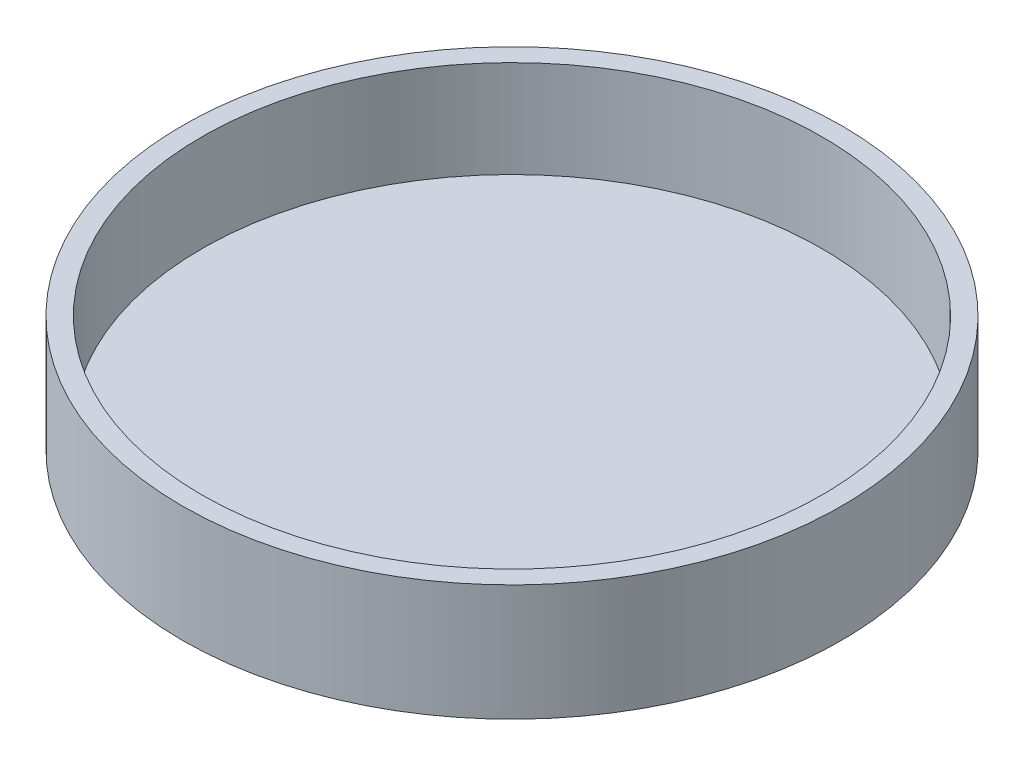
ISO-10303-21;
HEADER;
FILE_DESCRIPTION(('STEP AP214'),'2;1');
FILE_NAME('part.step','',(''),(''),'','','');
FILE_SCHEMA(('AUTOMOTIVE_DESIGN { 1 0 10303 214 1 1 1 1 }'));
ENDSEC;
DATA;
#1=APPLICATION_CONTEXT('core data for automotive mechanical design processes');
#2=APPLICATION_PROTOCOL_DEFINITION('international standard','automotive_design',2000,#1);
#3=PRODUCT_CONTEXT('',#1,'mechanical');
#4=PRODUCT('Part','Part','',(#3));
#5=PRODUCT_RELATED_PRODUCT_CATEGORY('part','',(#4));
#6=PRODUCT_DEFINITION_FORMATION('','',#4);
#7=PRODUCT_DEFINITION_CONTEXT('part definition',#1,'design');
#8=PRODUCT_DEFINITION('design','',#6,#7);
#9=PRODUCT_DEFINITION_SHAPE('','',#8);
#10=(LENGTH_UNIT() NAMED_UNIT(*) SI_UNIT(.MILLI.,.METRE.));
#11=(NAMED_UNIT(*) PLANE_ANGLE_UNIT() SI_UNIT($,.RADIAN.));
#12=(NAMED_UNIT(*) SI_UNIT($,.STERADIAN.) SOLID_ANGLE_UNIT());
#13=UNCERTAINTY_MEASURE_WITH_UNIT(LENGTH_MEASURE(1.E-05),#10,'distance_accuracy_value','');
#14=(GEOMETRIC_REPRESENTATION_CONTEXT(3) GLOBAL_UNCERTAINTY_ASSIGNED_CONTEXT((#13)) GLOBAL_UNIT_ASSIGNED_CONTEXT((#10,
#11,#12)) REPRESENTATION_CONTEXT('',''));
#15=CARTESIAN_POINT('',(0.,0.,0.));
#16=DIRECTION('',(0.,0.,1.));
#17=DIRECTION('',(1.,0.,0.));
#18=AXIS2_PLACEMENT_3D('',#15,#16,#17);
#19=CARTESIAN_POINT('',(0.,12.,0.));
#20=DIRECTION('',(0.,1.,0.));
#21=DIRECTION('',(0.,0.,1.));
#22=AXIS2_PLACEMENT_3D('',#19,#20,#21);
#23=PLANE('',#22);
#24=CARTESIAN_POINT('',(0.,12.,0.));
#25=DIRECTION('',(0.,1.,0.));
#26=DIRECTION('',(0.,0.,1.));
#27=AXIS2_PLACEMENT_3D('',#24,#25,#26);
#28=CIRCLE('',#27,34.);
#29=CARTESIAN_POINT('',(0.,12.,34.));
#30=VERTEX_POINT('',#29);
#31=EDGE_CURVE('E40',#30,#30,#28,.T.);
#32=ORIENTED_EDGE('',*,*,#31,.T.);
#33=EDGE_LOOP('',(#32));
#34=FACE_BOUND('',#33,.T.);
#35=CARTESIAN_POINT('',(0.,12.,0.));
#36=DIRECTION('',(0.,1.,0.));
#37=DIRECTION('',(0.,0.,1.));
#38=AXIS2_PLACEMENT_3D('',#35,#36,#37);
#39=CIRCLE('',#38,32.);
#40=CARTESIAN_POINT('',(0.,12.,32.));
#41=VERTEX_POINT('',#40);
#42=EDGE_CURVE('E49',#41,#41,#39,.T.);
#43=ORIENTED_EDGE('',*,*,#42,.F.);
#44=EDGE_LOOP('',(#43));
#45=FACE_BOUND('',#44,.T.);
#46=ADVANCED_FACE('F33',(#34,#45),#23,.T.);
#47=CARTESIAN_POINT('',(0.,0.,0.));
#48=DIRECTION('',(0.,1.,0.));
#49=DIRECTION('',(0.,0.,1.));
#50=AXIS2_PLACEMENT_3D('',#47,#48,#49);
#51=PLANE('',#50);
#52=CARTESIAN_POINT('',(0.,0.,0.));
#53=DIRECTION('',(0.,1.,0.));
#54=DIRECTION('',(0.,0.,1.));
#55=AXIS2_PLACEMENT_3D('',#52,#53,#54);
#56=CIRCLE('',#55,34.);
#57=CARTESIAN_POINT('',(0.,0.,34.));
#58=VERTEX_POINT('',#57);
#59=EDGE_CURVE('E44',#58,#58,#56,.T.);
#60=ORIENTED_EDGE('',*,*,#59,.F.);
#61=EDGE_LOOP('',(#60));
#62=FACE_BOUND('',#61,.T.);
#63=ADVANCED_FACE('F57',(#62),#51,.F.);
#64=CARTESIAN_POINT('',(0.,12.,0.));
#65=DIRECTION('',(0.,-1.,0.));
#66=DIRECTION('',(0.,0.,-1.));
#67=AXIS2_PLACEMENT_3D('',#64,#65,#66);
#68=CYLINDRICAL_SURFACE('',#67,34.);
#69=ORIENTED_EDGE('',*,*,#31,.F.);
#70=EDGE_LOOP('',(#69));
#71=FACE_BOUND('',#70,.T.);
#72=ORIENTED_EDGE('',*,*,#59,.T.);
#73=EDGE_LOOP('',(#72));
#74=FACE_BOUND('',#73,.T.);
#75=ADVANCED_FACE('F35',(#71,#74),#68,.T.);
#76=CARTESIAN_POINT('',(0.,12.,0.));
#77=DIRECTION('',(0.,-1.,0.));
#78=DIRECTION('',(0.,0.,-1.));
#79=AXIS2_PLACEMENT_3D('',#76,#77,#78);
#80=CYLINDRICAL_SURFACE('',#79,32.);
#81=CARTESIAN_POINT('',(0.,2.,0.));
#82=DIRECTION('',(0.,1.,0.));
#83=DIRECTION('',(0.,0.,1.));
#84=AXIS2_PLACEMENT_3D('',#81,#82,#83);
#85=CIRCLE('',#84,32.);
#86=CARTESIAN_POINT('',(0.,2.,32.));
#87=VERTEX_POINT('',#86);
#88=EDGE_CURVE('E10',#87,#87,#85,.T.);
#89=ORIENTED_EDGE('',*,*,#88,.F.);
#90=EDGE_LOOP('',(#89));
#91=FACE_BOUND('',#90,.T.);
#92=ORIENTED_EDGE('',*,*,#42,.T.);
#93=EDGE_LOOP('',(#92));
#94=FACE_BOUND('',#93,.T.);
#95=ADVANCED_FACE('F54',(#91,#94),#80,.F.);
#96=CARTESIAN_POINT('',(0.,2.,0.));
#97=DIRECTION('',(0.,1.,0.));
#98=DIRECTION('',(0.,0.,1.));
#99=AXIS2_PLACEMENT_3D('',#96,#97,#98);
#100=PLANE('',#99);
#101=ORIENTED_EDGE('',*,*,#88,.T.);
#102=EDGE_LOOP('',(#101));
#103=FACE_BOUND('',#102,.T.);
#104=ADVANCED_FACE('F66',(#103),#100,.T.);
#105=CLOSED_SHELL('',(#46,#63,#75,#95,#104));
#106=MANIFOLD_SOLID_BREP('B2',#105);
#107=ADVANCED_BREP_SHAPE_REPRESENTATION('',(#18,#106),#14);
#108=SHAPE_DEFINITION_REPRESENTATION(#9,#107);
ENDSEC;
END-ISO-10303-21;
